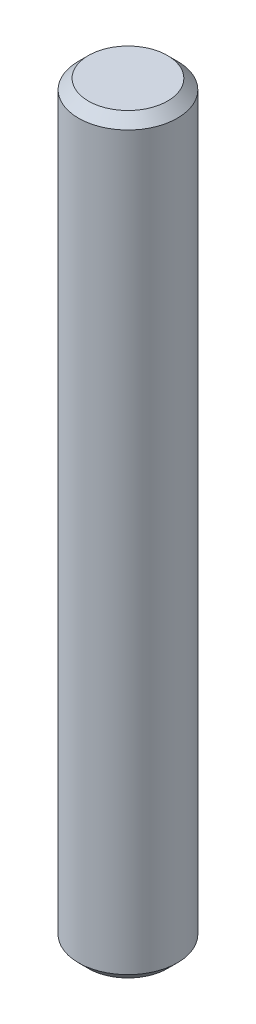
ISO-10303-21;
HEADER;
FILE_DESCRIPTION(('STEP AP214'),'2;1');
FILE_NAME('part.step','',(''),(''),'','','');
FILE_SCHEMA(('AUTOMOTIVE_DESIGN { 1 0 10303 214 1 1 1 1 }'));
ENDSEC;
DATA;
#1=APPLICATION_CONTEXT('core data for automotive mechanical design processes');
#2=APPLICATION_PROTOCOL_DEFINITION('international standard','automotive_design',2000,#1);
#3=PRODUCT_CONTEXT('',#1,'mechanical');
#4=PRODUCT('Part','Part','',(#3));
#5=PRODUCT_RELATED_PRODUCT_CATEGORY('part','',(#4));
#6=PRODUCT_DEFINITION_FORMATION('','',#4);
#7=PRODUCT_DEFINITION_CONTEXT('part definition',#1,'design');
#8=PRODUCT_DEFINITION('design','',#6,#7);
#9=PRODUCT_DEFINITION_SHAPE('','',#8);
#10=(LENGTH_UNIT() NAMED_UNIT(*) SI_UNIT(.MILLI.,.METRE.));
#11=(NAMED_UNIT(*) PLANE_ANGLE_UNIT() SI_UNIT($,.RADIAN.));
#12=(NAMED_UNIT(*) SI_UNIT($,.STERADIAN.) SOLID_ANGLE_UNIT());
#13=UNCERTAINTY_MEASURE_WITH_UNIT(LENGTH_MEASURE(1.E-05),#10,'distance_accuracy_value','');
#14=(GEOMETRIC_REPRESENTATION_CONTEXT(3) GLOBAL_UNCERTAINTY_ASSIGNED_CONTEXT((#13)) GLOBAL_UNIT_ASSIGNED_CONTEXT((#10,
#11,#12)) REPRESENTATION_CONTEXT('',''));
#15=CARTESIAN_POINT('',(0.,0.,0.));
#16=DIRECTION('',(0.,0.,1.));
#17=DIRECTION('',(1.,0.,0.));
#18=AXIS2_PLACEMENT_3D('',#15,#16,#17);
#19=CARTESIAN_POINT('',(0.,38.,0.));
#20=DIRECTION('',(0.,-1.,0.));
#21=DIRECTION('',(0.,0.,-1.));
#22=AXIS2_PLACEMENT_3D('',#19,#20,#21);
#23=CYLINDRICAL_SURFACE('',#22,5.);
#24=CARTESIAN_POINT('',(0.,-37.,0.));
#25=DIRECTION('',(0.,1.,0.));
#26=DIRECTION('',(0.,0.,1.));
#27=AXIS2_PLACEMENT_3D('',#24,#25,#26);
#28=CIRCLE('',#27,5.);
#29=CARTESIAN_POINT('',(0.,-37.,5.));
#30=VERTEX_POINT('',#29);
#31=EDGE_CURVE('E59',#30,#30,#28,.T.);
#32=ORIENTED_EDGE('',*,*,#31,.T.);
#33=EDGE_LOOP('',(#32));
#34=FACE_BOUND('',#33,.T.);
#35=CARTESIAN_POINT('',(0.,37.,0.));
#36=DIRECTION('',(0.,1.,0.));
#37=DIRECTION('',(0.,0.,1.));
#38=AXIS2_PLACEMENT_3D('',#35,#36,#37);
#39=CIRCLE('',#38,5.);
#40=CARTESIAN_POINT('',(0.,37.,5.));
#41=VERTEX_POINT('',#40);
#42=EDGE_CURVE('E64',#41,#41,#39,.F.);
#43=ORIENTED_EDGE('',*,*,#42,.T.);
#44=EDGE_LOOP('',(#43));
#45=FACE_BOUND('',#44,.T.);
#46=ADVANCED_FACE('F45',(#34,#45),#23,.T.);
#47=CARTESIAN_POINT('',(0.,38.,0.));
#48=DIRECTION('',(0.,1.,0.));
#49=DIRECTION('',(0.,0.,1.));
#50=AXIS2_PLACEMENT_3D('',#47,#48,#49);
#51=PLANE('',#50);
#52=CARTESIAN_POINT('',(0.,38.,0.));
#53=DIRECTION('',(0.,1.,0.));
#54=DIRECTION('',(0.,0.,1.));
#55=AXIS2_PLACEMENT_3D('',#52,#53,#54);
#56=CIRCLE('',#55,4.);
#57=CARTESIAN_POINT('',(0.,38.,4.));
#58=VERTEX_POINT('',#57);
#59=EDGE_CURVE('E10',#58,#58,#56,.T.);
#60=ORIENTED_EDGE('',*,*,#59,.T.);
#61=EDGE_LOOP('',(#60));
#62=FACE_BOUND('',#61,.T.);
#63=ADVANCED_FACE('F81',(#62),#51,.T.);
#64=CARTESIAN_POINT('',(0.,-38.,0.));
#65=DIRECTION('',(0.,1.,0.));
#66=DIRECTION('',(0.,0.,1.));
#67=AXIS2_PLACEMENT_3D('',#64,#65,#66);
#68=PLANE('',#67);
#69=CARTESIAN_POINT('',(0.,-38.,0.));
#70=DIRECTION('',(0.,1.,0.));
#71=DIRECTION('',(0.,0.,1.));
#72=AXIS2_PLACEMENT_3D('',#69,#70,#71);
#73=CIRCLE('',#72,4.);
#74=CARTESIAN_POINT('',(0.,-38.,4.));
#75=VERTEX_POINT('',#74);
#76=EDGE_CURVE('E54',#75,#75,#73,.F.);
#77=ORIENTED_EDGE('',*,*,#76,.T.);
#78=EDGE_LOOP('',(#77));
#79=FACE_BOUND('',#78,.T.);
#80=ADVANCED_FACE('F78',(#79),#68,.F.);
#81=CARTESIAN_POINT('',(0.,-37.,0.));
#82=DIRECTION('',(0.,1.,0.));
#83=DIRECTION('',(0.,0.,1.));
#84=AXIS2_PLACEMENT_3D('',#81,#82,#83);
#85=CONICAL_SURFACE('',#84,5.,0.785398163397457);
#86=ORIENTED_EDGE('',*,*,#76,.F.);
#87=EDGE_LOOP('',(#86));
#88=FACE_BOUND('',#87,.T.);
#89=ORIENTED_EDGE('',*,*,#31,.F.);
#90=EDGE_LOOP('',(#89));
#91=FACE_BOUND('',#90,.T.);
#92=ADVANCED_FACE('F74',(#88,#91),#85,.T.);
#93=CARTESIAN_POINT('',(0.,38.,0.));
#94=DIRECTION('',(0.,-1.,0.));
#95=DIRECTION('',(0.,0.,-1.));
#96=AXIS2_PLACEMENT_3D('',#93,#94,#95);
#97=CONICAL_SURFACE('',#96,4.,0.78539816339745);
#98=ORIENTED_EDGE('',*,*,#42,.F.);
#99=EDGE_LOOP('',(#98));
#100=FACE_BOUND('',#99,.T.);
#101=ORIENTED_EDGE('',*,*,#59,.F.);
#102=EDGE_LOOP('',(#101));
#103=FACE_BOUND('',#102,.T.);
#104=ADVANCED_FACE('F48',(#100,#103),#97,.T.);
#105=CLOSED_SHELL('',(#46,#63,#80,#92,#104));
#106=MANIFOLD_SOLID_BREP('B2',#105);
#107=ADVANCED_BREP_SHAPE_REPRESENTATION('',(#18,#106),#14);
#108=SHAPE_DEFINITION_REPRESENTATION(#9,#107);
ENDSEC;
END-ISO-10303-21;
